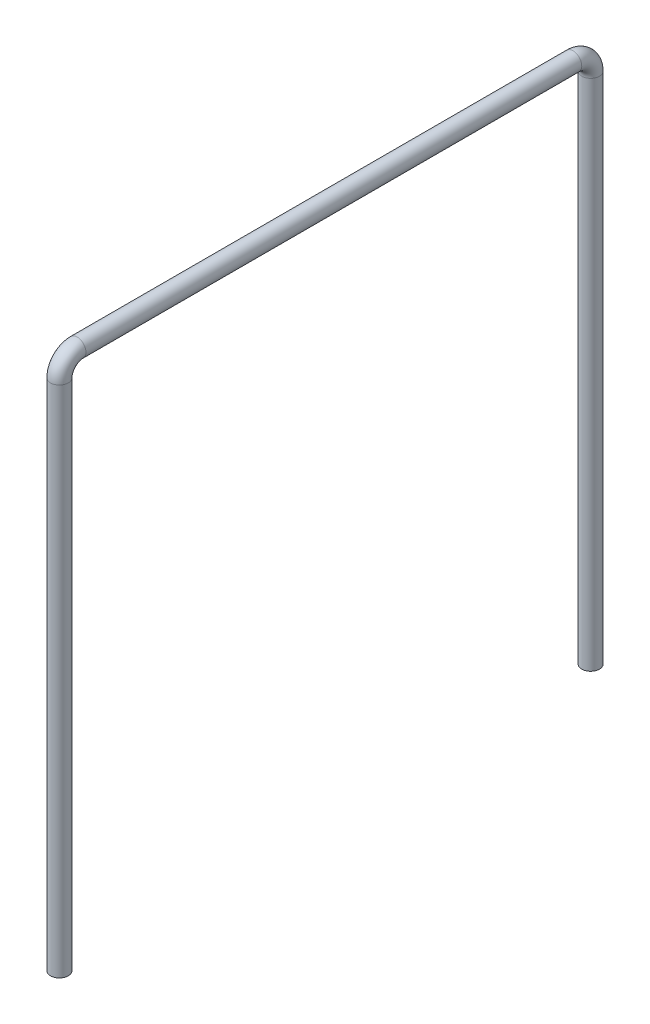
ISO-10303-21;
HEADER;
FILE_DESCRIPTION(('STEP AP214'),'2;1');
FILE_NAME('part.step','',(''),(''),'','','');
FILE_SCHEMA(('AUTOMOTIVE_DESIGN { 1 0 10303 214 1 1 1 1 }'));
ENDSEC;
DATA;
#1=APPLICATION_CONTEXT('core data for automotive mechanical design processes');
#2=APPLICATION_PROTOCOL_DEFINITION('international standard','automotive_design',2000,#1);
#3=PRODUCT_CONTEXT('',#1,'mechanical');
#4=PRODUCT('Part','Part','',(#3));
#5=PRODUCT_RELATED_PRODUCT_CATEGORY('part','',(#4));
#6=PRODUCT_DEFINITION_FORMATION('','',#4);
#7=PRODUCT_DEFINITION_CONTEXT('part definition',#1,'design');
#8=PRODUCT_DEFINITION('design','',#6,#7);
#9=PRODUCT_DEFINITION_SHAPE('','',#8);
#10=(LENGTH_UNIT() NAMED_UNIT(*) SI_UNIT(.MILLI.,.METRE.));
#11=(NAMED_UNIT(*) PLANE_ANGLE_UNIT() SI_UNIT($,.RADIAN.));
#12=(NAMED_UNIT(*) SI_UNIT($,.STERADIAN.) SOLID_ANGLE_UNIT());
#13=UNCERTAINTY_MEASURE_WITH_UNIT(LENGTH_MEASURE(1.E-05),#10,'distance_accuracy_value','');
#14=(GEOMETRIC_REPRESENTATION_CONTEXT(3) GLOBAL_UNCERTAINTY_ASSIGNED_CONTEXT((#13)) GLOBAL_UNIT_ASSIGNED_CONTEXT((#10,
#11,#12)) REPRESENTATION_CONTEXT('',''));
#15=CARTESIAN_POINT('',(0.,0.,0.));
#16=DIRECTION('',(0.,0.,1.));
#17=DIRECTION('',(1.,0.,0.));
#18=AXIS2_PLACEMENT_3D('',#15,#16,#17);
#19=CARTESIAN_POINT('',(0.,-300.,-150.));
#20=DIRECTION('',(0.,1.,0.));
#21=DIRECTION('',(1.,0.,0.));
#22=AXIS2_PLACEMENT_3D('',#19,#20,#21);
#23=PLANE('',#22);
#24=CARTESIAN_POINT('',(0.,-300.,-150.));
#25=DIRECTION('',(0.,1.,0.));
#26=DIRECTION('',(1.,0.,0.));
#27=AXIS2_PLACEMENT_3D('',#24,#25,#26);
#28=CIRCLE('',#27,5.00000000000001);
#29=CARTESIAN_POINT('',(5.00000000000001,-300.,-150.));
#30=VERTEX_POINT('',#29);
#31=EDGE_CURVE('E45',#30,#30,#28,.T.);
#32=ORIENTED_EDGE('',*,*,#31,.F.);
#33=EDGE_LOOP('',(#32));
#34=FACE_BOUND('',#33,.T.);
#35=ADVANCED_FACE('F33',(#34),#23,.F.);
#36=CARTESIAN_POINT('',(0.,-300.,150.));
#37=DIRECTION('',(0.,-1.,0.));
#38=DIRECTION('',(1.,0.,0.));
#39=AXIS2_PLACEMENT_3D('',#36,#37,#38);
#40=PLANE('',#39);
#41=CARTESIAN_POINT('',(0.,-300.,150.));
#42=DIRECTION('',(0.,-1.,0.));
#43=DIRECTION('',(1.,0.,0.));
#44=AXIS2_PLACEMENT_3D('',#41,#42,#43);
#45=CIRCLE('',#44,5.00000000000001);
#46=CARTESIAN_POINT('',(5.00000000000001,-300.,150.));
#47=VERTEX_POINT('',#46);
#48=EDGE_CURVE('E11',#47,#47,#45,.T.);
#49=ORIENTED_EDGE('',*,*,#48,.T.);
#50=EDGE_LOOP('',(#49));
#51=FACE_BOUND('',#50,.T.);
#52=ADVANCED_FACE('F48',(#51),#40,.T.);
#53=CARTESIAN_POINT('',(0.,-300.,-150.));
#54=DIRECTION('',(0.,1.,0.));
#55=DIRECTION('',(0.,0.,1.));
#56=AXIS2_PLACEMENT_3D('',#53,#54,#55);
#57=CYLINDRICAL_SURFACE('',#56,5.00000000000001);
#58=CARTESIAN_POINT('',(0.,-10.0000000000001,-150.));
#59=DIRECTION('',(0.,1.,0.));
#60=DIRECTION('',(1.,0.,0.));
#61=AXIS2_PLACEMENT_3D('',#58,#59,#60);
#62=CIRCLE('',#61,5.00000000000001);
#63=CARTESIAN_POINT('',(0.,-10.0000000000001,-155.));
#64=VERTEX_POINT('',#63);
#65=EDGE_CURVE('E65',#64,#64,#62,.T.);
#66=ORIENTED_EDGE('',*,*,#65,.F.);
#67=EDGE_LOOP('',(#66));
#68=FACE_BOUND('',#67,.T.);
#69=ORIENTED_EDGE('',*,*,#31,.T.);
#70=EDGE_LOOP('',(#69));
#71=FACE_BOUND('',#70,.T.);
#72=ADVANCED_FACE('F69',(#68,#71),#57,.T.);
#73=CARTESIAN_POINT('',(0.,-10.,-140.));
#74=DIRECTION('',(1.,0.,0.));
#75=DIRECTION('',(0.,0.,-1.));
#76=AXIS2_PLACEMENT_3D('',#73,#74,#75);
#77=TOROIDAL_SURFACE('',#76,10.,5.00000000000001);
#78=CARTESIAN_POINT('',(0.,0.,-140.));
#79=DIRECTION('',(0.,0.,1.));
#80=DIRECTION('',(1.,0.,0.));
#81=AXIS2_PLACEMENT_3D('',#78,#79,#80);
#82=CIRCLE('',#81,5.00000000000001);
#83=CARTESIAN_POINT('',(0.,5.00000000000002,-140.));
#84=VERTEX_POINT('',#83);
#85=EDGE_CURVE('E60',#84,#84,#82,.T.);
#86=CARTESIAN_POINT('',(0.,-10.,-140.));
#87=DIRECTION('',(1.,0.,0.));
#88=DIRECTION('',(0.,0.,-1.));
#89=AXIS2_PLACEMENT_3D('',#86,#87,#88);
#90=CIRCLE('',#89,15.);
#91=EDGE_CURVE('',#64,#84,#90,.T.);
#92=ORIENTED_EDGE('',*,*,#65,.T.);
#93=ORIENTED_EDGE('',*,*,#85,.F.);
#94=ORIENTED_EDGE('',*,*,#91,.T.);
#95=ORIENTED_EDGE('',*,*,#91,.F.);
#96=EDGE_LOOP('',(#92,#94,#93,#95));
#97=FACE_BOUND('',#96,.T.);
#98=ADVANCED_FACE('F71',(#97),#77,.T.);
#99=CARTESIAN_POINT('',(0.,0.,-140.));
#100=DIRECTION('',(0.,0.,1.));
#101=DIRECTION('',(1.,0.,0.));
#102=AXIS2_PLACEMENT_3D('',#99,#100,#101);
#103=CYLINDRICAL_SURFACE('',#102,5.00000000000001);
#104=CARTESIAN_POINT('',(0.,0.,140.));
#105=DIRECTION('',(0.,0.,1.));
#106=DIRECTION('',(1.,0.,0.));
#107=AXIS2_PLACEMENT_3D('',#104,#105,#106);
#108=CIRCLE('',#107,5.00000000000001);
#109=CARTESIAN_POINT('',(0.,5.00000000000001,140.));
#110=VERTEX_POINT('',#109);
#111=EDGE_CURVE('E58',#110,#110,#108,.T.);
#112=ORIENTED_EDGE('',*,*,#111,.F.);
#113=EDGE_LOOP('',(#112));
#114=FACE_BOUND('',#113,.T.);
#115=ORIENTED_EDGE('',*,*,#85,.T.);
#116=EDGE_LOOP('',(#115));
#117=FACE_BOUND('',#116,.T.);
#118=ADVANCED_FACE('F78',(#114,#117),#103,.T.);
#119=CARTESIAN_POINT('',(0.,-10.,140.));
#120=DIRECTION('',(1.,0.,0.));
#121=DIRECTION('',(0.,0.,-1.));
#122=AXIS2_PLACEMENT_3D('',#119,#120,#121);
#123=TOROIDAL_SURFACE('',#122,10.,5.00000000000001);
#124=CARTESIAN_POINT('',(0.,-10.,150.));
#125=DIRECTION('',(0.,-1.,0.));
#126=DIRECTION('',(1.,0.,0.));
#127=AXIS2_PLACEMENT_3D('',#124,#125,#126);
#128=CIRCLE('',#127,5.00000000000001);
#129=CARTESIAN_POINT('',(0.,-10.,155.));
#130=VERTEX_POINT('',#129);
#131=EDGE_CURVE('E40',#130,#130,#128,.T.);
#132=CARTESIAN_POINT('',(0.,-10.,140.));
#133=DIRECTION('',(1.,0.,0.));
#134=DIRECTION('',(0.,0.,-1.));
#135=AXIS2_PLACEMENT_3D('',#132,#133,#134);
#136=CIRCLE('',#135,15.);
#137=EDGE_CURVE('',#110,#130,#136,.T.);
#138=ORIENTED_EDGE('',*,*,#111,.T.);
#139=ORIENTED_EDGE('',*,*,#131,.F.);
#140=ORIENTED_EDGE('',*,*,#137,.T.);
#141=ORIENTED_EDGE('',*,*,#137,.F.);
#142=EDGE_LOOP('',(#138,#140,#139,#141));
#143=FACE_BOUND('',#142,.T.);
#144=ADVANCED_FACE('F53',(#143),#123,.T.);
#145=CARTESIAN_POINT('',(0.,-10.0000000000001,150.));
#146=DIRECTION('',(0.,-1.,0.));
#147=DIRECTION('',(0.,0.,-1.));
#148=AXIS2_PLACEMENT_3D('',#145,#146,#147);
#149=CYLINDRICAL_SURFACE('',#148,5.00000000000001);
#150=ORIENTED_EDGE('',*,*,#48,.F.);
#151=EDGE_LOOP('',(#150));
#152=FACE_BOUND('',#151,.T.);
#153=ORIENTED_EDGE('',*,*,#131,.T.);
#154=EDGE_LOOP('',(#153));
#155=FACE_BOUND('',#154,.T.);
#156=ADVANCED_FACE('F50',(#152,#155),#149,.T.);
#157=CLOSED_SHELL('',(#35,#52,#72,#98,#118,#144,#156));
#158=MANIFOLD_SOLID_BREP('B2',#157);
#159=ADVANCED_BREP_SHAPE_REPRESENTATION('',(#18,#158),#14);
#160=SHAPE_DEFINITION_REPRESENTATION(#9,#159);
ENDSEC;
END-ISO-10303-21;
